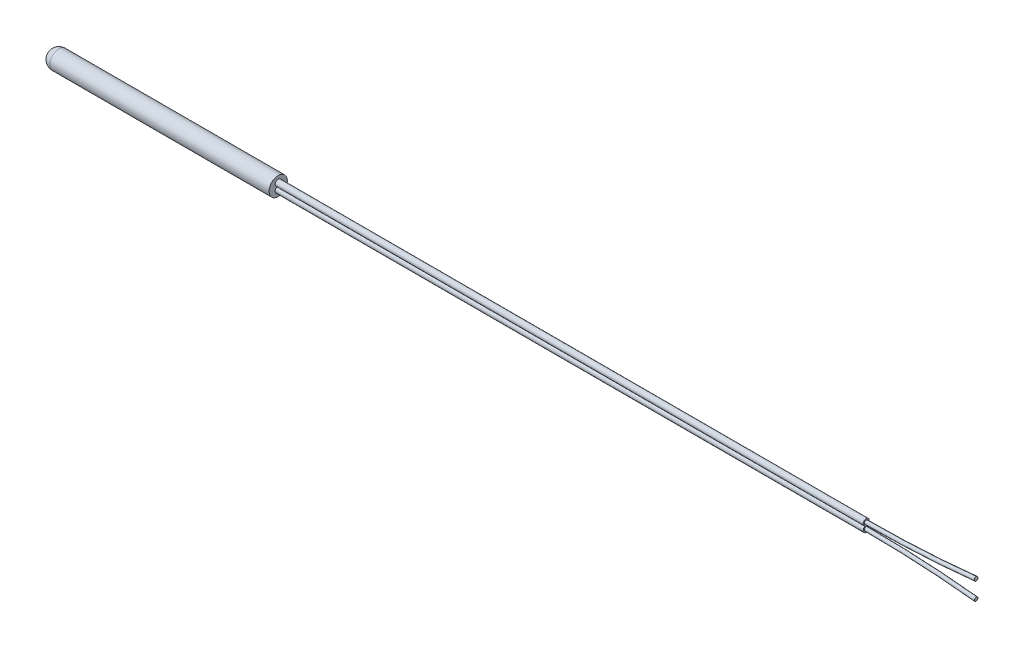
ISO-10303-21;
HEADER;
FILE_DESCRIPTION(('STEP AP214'),'2;1');
FILE_NAME('part.step','',(''),(''),'','','');
FILE_SCHEMA(('AUTOMOTIVE_DESIGN { 1 0 10303 214 1 1 1 1 }'));
ENDSEC;
DATA;
#1=APPLICATION_CONTEXT('core data for automotive mechanical design processes');
#2=APPLICATION_PROTOCOL_DEFINITION('international standard','automotive_design',2000,#1);
#3=PRODUCT_CONTEXT('',#1,'mechanical');
#4=PRODUCT('Part','Part','',(#3));
#5=PRODUCT_RELATED_PRODUCT_CATEGORY('part','',(#4));
#6=PRODUCT_DEFINITION_FORMATION('','',#4);
#7=PRODUCT_DEFINITION_CONTEXT('part definition',#1,'design');
#8=PRODUCT_DEFINITION('design','',#6,#7);
#9=PRODUCT_DEFINITION_SHAPE('','',#8);
#10=(LENGTH_UNIT() NAMED_UNIT(*) SI_UNIT(.MILLI.,.METRE.));
#11=(NAMED_UNIT(*) PLANE_ANGLE_UNIT() SI_UNIT($,.RADIAN.));
#12=(NAMED_UNIT(*) SI_UNIT($,.STERADIAN.) SOLID_ANGLE_UNIT());
#13=UNCERTAINTY_MEASURE_WITH_UNIT(LENGTH_MEASURE(1.E-05),#10,'distance_accuracy_value','');
#14=(GEOMETRIC_REPRESENTATION_CONTEXT(3) GLOBAL_UNCERTAINTY_ASSIGNED_CONTEXT((#13)) GLOBAL_UNIT_ASSIGNED_CONTEXT((#10,
#11,#12)) REPRESENTATION_CONTEXT('',''));
#15=CARTESIAN_POINT('',(0.,0.,0.));
#16=DIRECTION('',(0.,0.,1.));
#17=DIRECTION('',(1.,0.,0.));
#18=AXIS2_PLACEMENT_3D('',#15,#16,#17);
#19=CARTESIAN_POINT('',(34.0395985035608,0.,0.));
#20=DIRECTION('',(-1.,0.,0.));
#21=DIRECTION('',(0.,0.,0.999999999999998));
#22=AXIS2_PLACEMENT_3D('',#19,#20,#21);
#23=PLANE('',#22);
#24=CARTESIAN_POINT('',(34.0395985035608,0.121799289195743,0.));
#25=DIRECTION('',(-1.,0.,0.));
#26=DIRECTION('',(0.,0.,-0.999999999999998));
#27=AXIS2_PLACEMENT_3D('',#24,#25,#26);
#28=CIRCLE('',#27,0.0777066823762968);
#29=CARTESIAN_POINT('',(34.0395985035608,0.0440926068194375,0.));
#30=VERTEX_POINT('',#29);
#31=EDGE_CURVE('E150',#30,#30,#28,.T.);
#32=ORIENTED_EDGE('',*,*,#31,.T.);
#33=EDGE_LOOP('',(#32));
#34=FACE_BOUND('',#33,.T.);
#35=CARTESIAN_POINT('',(34.0395985035608,-0.121799289195812,0.));
#36=DIRECTION('',(1.,0.,0.));
#37=DIRECTION('',(0.,0.,0.999999999999998));
#38=AXIS2_PLACEMENT_3D('',#35,#36,#37);
#39=CIRCLE('',#38,0.127);
#40=CARTESIAN_POINT('',(34.0395985035609,0.,0.0359712823151618));
#41=VERTEX_POINT('',#40);
#42=CARTESIAN_POINT('',(34.0395985035608,0.,-0.0359712823152711));
#43=VERTEX_POINT('',#42);
#44=EDGE_CURVE('E90',#41,#43,#39,.T.);
#45=ORIENTED_EDGE('',*,*,#44,.T.);
#46=CARTESIAN_POINT('',(34.0395985035608,0.121799289195743,0.));
#47=DIRECTION('',(1.,0.,0.));
#48=DIRECTION('',(0.,0.,-0.999999999999998));
#49=AXIS2_PLACEMENT_3D('',#46,#47,#48);
#50=CIRCLE('',#49,0.127);
#51=EDGE_CURVE('E100',#43,#41,#50,.T.);
#52=ORIENTED_EDGE('',*,*,#51,.T.);
#53=EDGE_LOOP('',(#45,#52));
#54=FACE_BOUND('',#53,.T.);
#55=CARTESIAN_POINT('',(34.0395985035608,-0.121799289195812,0.));
#56=DIRECTION('',(-1.,0.,0.));
#57=DIRECTION('',(0.,0.,0.999999999999998));
#58=AXIS2_PLACEMENT_3D('',#55,#56,#57);
#59=CIRCLE('',#58,0.0777066823762968);
#60=CARTESIAN_POINT('',(34.0395985035608,-0.0440926068194028,0.));
#61=VERTEX_POINT('',#60);
#62=EDGE_CURVE('E11',#61,#61,#59,.F.);
#63=ORIENTED_EDGE('',*,*,#62,.F.);
#64=EDGE_LOOP('',(#63));
#65=FACE_BOUND('',#64,.T.);
#66=ADVANCED_FACE('F49',(#34,#54,#65),#23,.F.);
#67=CARTESIAN_POINT('',(9.52499999999999,0.380999999999999,0.));
#68=DIRECTION('',(-1.,0.,0.));
#69=DIRECTION('',(0.,0.,0.999999999999998));
#70=AXIS2_PLACEMENT_3D('',#67,#68,#69);
#71=PLANE('',#70);
#72=CARTESIAN_POINT('',(9.52499999999999,0.,0.));
#73=DIRECTION('',(-1.,0.,0.));
#74=DIRECTION('',(0.,0.,0.999999999999998));
#75=AXIS2_PLACEMENT_3D('',#72,#73,#74);
#76=CIRCLE('',#75,0.381);
#77=CARTESIAN_POINT('',(9.52499999999999,0.,0.380999999999998));
#78=VERTEX_POINT('',#77);
#79=EDGE_CURVE('E58',#78,#78,#76,.T.);
#80=ORIENTED_EDGE('',*,*,#79,.F.);
#81=EDGE_LOOP('',(#80));
#82=FACE_BOUND('',#81,.T.);
#83=CARTESIAN_POINT('',(9.525,-0.121799289195784,0.));
#84=DIRECTION('',(1.,0.,0.));
#85=DIRECTION('',(0.,0.,0.999999999999998));
#86=AXIS2_PLACEMENT_3D('',#83,#84,#85);
#87=CIRCLE('',#86,0.127);
#88=CARTESIAN_POINT('',(9.52499999999999,0.,0.0359712823152485));
#89=VERTEX_POINT('',#88);
#90=CARTESIAN_POINT('',(9.52499999999998,0.,-0.035971282315252));
#91=VERTEX_POINT('',#90);
#92=EDGE_CURVE('E77',#89,#91,#87,.T.);
#93=ORIENTED_EDGE('',*,*,#92,.F.);
#94=CARTESIAN_POINT('',(9.52499999999999,0.12179928919577,0.));
#95=DIRECTION('',(1.,0.,0.));
#96=DIRECTION('',(0.,0.,-0.999999999999998));
#97=AXIS2_PLACEMENT_3D('',#94,#95,#96);
#98=CIRCLE('',#97,0.127);
#99=EDGE_CURVE('E64',#91,#89,#98,.T.);
#100=ORIENTED_EDGE('',*,*,#99,.F.);
#101=EDGE_LOOP('',(#93,#100));
#102=FACE_BOUND('',#101,.T.);
#103=ADVANCED_FACE('F78',(#82,#102),#71,.F.);
#104=CARTESIAN_POINT('',(0.38100000000002,0.,0.));
#105=DIRECTION('',(-1.,0.,0.));
#106=DIRECTION('',(0.,0.999999999999999,0.));
#107=AXIS2_PLACEMENT_3D('',#104,#105,#106);
#108=SPHERICAL_SURFACE('',#107,0.380999999999999);
#109=CARTESIAN_POINT('',(0.38100000000002,0.,0.));
#110=DIRECTION('',(-1.,0.,0.));
#111=DIRECTION('',(0.,0.,0.999999999999998));
#112=AXIS2_PLACEMENT_3D('',#109,#110,#111);
#113=CIRCLE('',#112,0.380999999999999);
#114=CARTESIAN_POINT('',(0.38100000000002,0.,0.380999999999999));
#115=VERTEX_POINT('',#114);
#116=EDGE_CURVE('E103',#115,#115,#113,.T.);
#117=ORIENTED_EDGE('',*,*,#116,.T.);
#118=EDGE_LOOP('',(#117));
#119=FACE_BOUND('',#118,.T.);
#120=ADVANCED_FACE('F51',(#119),#108,.T.);
#121=CARTESIAN_POINT('',(0.,0.,0.));
#122=DIRECTION('',(-1.,0.,0.));
#123=DIRECTION('',(0.,0.,0.999999999999998));
#124=AXIS2_PLACEMENT_3D('',#121,#122,#123);
#125=CYLINDRICAL_SURFACE('',#124,0.380999999999999);
#126=CARTESIAN_POINT('',(0.38100000000002,0.,0.380999999999999));
#127=CARTESIAN_POINT('',(0.47625000000002,0.,0.380999999999999));
#128=CARTESIAN_POINT('',(0.57150000000002,0.,0.380999999999999));
#129=CARTESIAN_POINT('',(0.762000000000019,0.,0.380999999999999));
#130=CARTESIAN_POINT('',(0.857250000000019,0.,0.380999999999999));
#131=CARTESIAN_POINT('',(1.04775000000002,0.,0.380999999999999));
#132=CARTESIAN_POINT('',(1.14300000000002,0.,0.380999999999998));
#133=CARTESIAN_POINT('',(1.33350000000002,0.,0.380999999999998));
#134=CARTESIAN_POINT('',(1.42875000000002,0.,0.380999999999998));
#135=CARTESIAN_POINT('',(1.61925000000002,0.,0.380999999999998));
#136=CARTESIAN_POINT('',(1.71450000000002,0.,0.380999999999998));
#137=CARTESIAN_POINT('',(1.90500000000002,0.,0.380999999999998));
#138=CARTESIAN_POINT('',(2.00025000000001,0.,0.380999999999998));
#139=CARTESIAN_POINT('',(2.19075000000001,0.,0.380999999999998));
#140=CARTESIAN_POINT('',(2.28600000000001,0.,0.380999999999998));
#141=CARTESIAN_POINT('',(2.47650000000001,0.,0.380999999999998));
#142=CARTESIAN_POINT('',(2.57175000000001,0.,0.380999999999998));
#143=CARTESIAN_POINT('',(2.76225000000001,0.,0.380999999999998));
#144=CARTESIAN_POINT('',(2.85750000000001,0.,0.380999999999998));
#145=CARTESIAN_POINT('',(3.04800000000001,0.,0.380999999999998));
#146=CARTESIAN_POINT('',(3.14325000000001,0.,0.380999999999998));
#147=CARTESIAN_POINT('',(3.33375000000001,0.,0.380999999999998));
#148=CARTESIAN_POINT('',(3.42900000000001,0.,0.380999999999998));
#149=CARTESIAN_POINT('',(3.61950000000001,0.,0.380999999999998));
#150=CARTESIAN_POINT('',(3.71475000000001,0.,0.380999999999998));
#151=CARTESIAN_POINT('',(3.90525000000001,0.,0.380999999999998));
#152=CARTESIAN_POINT('',(4.00050000000001,0.,0.380999999999998));
#153=CARTESIAN_POINT('',(4.19100000000001,0.,0.380999999999998));
#154=CARTESIAN_POINT('',(4.28625000000001,0.,0.380999999999998));
#155=CARTESIAN_POINT('',(4.47675000000001,0.,0.380999999999998));
#156=CARTESIAN_POINT('',(4.57200000000001,0.,0.380999999999998));
#157=CARTESIAN_POINT('',(4.76250000000001,0.,0.380999999999998));
#158=CARTESIAN_POINT('',(4.85775000000001,0.,0.380999999999998));
#159=CARTESIAN_POINT('',(5.04825,0.,0.380999999999998));
#160=CARTESIAN_POINT('',(5.1435,0.,0.380999999999998));
#161=CARTESIAN_POINT('',(5.334,0.,0.380999999999998));
#162=CARTESIAN_POINT('',(5.42925,0.,0.380999999999998));
#163=CARTESIAN_POINT('',(5.61975,0.,0.380999999999998));
#164=CARTESIAN_POINT('',(5.715,0.,0.380999999999998));
#165=CARTESIAN_POINT('',(5.9055,0.,0.380999999999998));
#166=CARTESIAN_POINT('',(6.00075,0.,0.380999999999998));
#167=CARTESIAN_POINT('',(6.19125,0.,0.380999999999998));
#168=CARTESIAN_POINT('',(6.2865,0.,0.380999999999998));
#169=CARTESIAN_POINT('',(6.477,0.,0.380999999999998));
#170=CARTESIAN_POINT('',(6.57225,0.,0.380999999999998));
#171=CARTESIAN_POINT('',(6.76275,0.,0.380999999999998));
#172=CARTESIAN_POINT('',(6.858,0.,0.380999999999998));
#173=CARTESIAN_POINT('',(7.0485,0.,0.380999999999998));
#174=CARTESIAN_POINT('',(7.14375,0.,0.380999999999998));
#175=CARTESIAN_POINT('',(7.33425,0.,0.380999999999998));
#176=CARTESIAN_POINT('',(7.4295,0.,0.380999999999998));
#177=CARTESIAN_POINT('',(7.62,0.,0.380999999999998));
#178=CARTESIAN_POINT('',(7.71525,0.,0.380999999999998));
#179=CARTESIAN_POINT('',(7.90575,0.,0.380999999999998));
#180=CARTESIAN_POINT('',(8.00099999999999,0.,0.380999999999998));
#181=CARTESIAN_POINT('',(8.19149999999999,0.,0.380999999999998));
#182=CARTESIAN_POINT('',(8.28674999999999,0.,0.380999999999998));
#183=CARTESIAN_POINT('',(8.47724999999999,0.,0.380999999999998));
#184=CARTESIAN_POINT('',(8.57249999999999,0.,0.380999999999998));
#185=CARTESIAN_POINT('',(8.76299999999999,0.,0.380999999999998));
#186=CARTESIAN_POINT('',(8.85824999999999,0.,0.380999999999998));
#187=CARTESIAN_POINT('',(9.04874999999999,0.,0.380999999999998));
#188=CARTESIAN_POINT('',(9.14399999999999,0.,0.380999999999998));
#189=CARTESIAN_POINT('',(9.33449999999999,0.,0.380999999999998));
#190=CARTESIAN_POINT('',(9.42974999999999,0.,0.380999999999998));
#191=CARTESIAN_POINT('',(9.52499999999999,0.,0.380999999999998));
#192=B_SPLINE_CURVE_WITH_KNOTS('',3,(#126,#127,#128,#129,#130,#131,#132,#133,#134,#135,#136,
#137,#138,#139,#140,#141,#142,#143,#144,#145,#146,#147,#148,#149,#150,#151,#152,#153,#154,#155,
#156,#157,#158,#159,#160,#161,#162,#163,#164,#165,#166,#167,#168,#169,#170,#171,#172,#173,#174,
#175,#176,#177,#178,#179,#180,#181,#182,#183,#184,#185,#186,#187,#188,#189,#190,#191),
.UNSPECIFIED.,.F.,.F.,(4,2,2,2,2,2,2,2,2,2,2,2,2,2,2,2,2,2,2,2,2,2,2,2,2,2,2,2,2,2,2,2,4),(0.,
0.285749999999999,0.571499999999998,0.857249999999997,1.143,1.42875,1.71449999999999,
2.00024999999999,2.28599999999999,2.57174999999999,2.85749999999999,3.14324999999999,
3.42899999999999,3.71474999999999,4.00049999999999,4.28624999999999,4.57199999999998,
4.85774999999998,5.14349999999998,5.42924999999998,5.71499999999998,6.00074999999998,
6.28649999999998,6.57224999999998,6.85799999999998,7.14374999999998,7.42949999999998,
7.71524999999997,8.00099999999997,8.28674999999997,8.57249999999997,8.85824999999997,
9.14399999999997),.UNSPECIFIED.);
#193=EDGE_CURVE('BSEAM111',#115,#78,#192,.T.);
#194=ORIENTED_EDGE('',*,*,#116,.F.);
#195=ORIENTED_EDGE('',*,*,#79,.T.);
#196=ORIENTED_EDGE('',*,*,#193,.T.);
#197=ORIENTED_EDGE('',*,*,#193,.F.);
#198=EDGE_LOOP('',(#194,#196,#195,#197));
#199=FACE_BOUND('',#198,.T.);
#200=ADVANCED_FACE('F111',(#199),#125,.T.);
#201=CARTESIAN_POINT('',(9.6674128364997,-0.121799289195756,0.));
#202=DIRECTION('',(-1.,0.,0.));
#203=DIRECTION('',(0.,0.,0.999999999999998));
#204=AXIS2_PLACEMENT_3D('',#201,#202,#203);
#205=CYLINDRICAL_SURFACE('',#204,0.127);
#206=ORIENTED_EDGE('',*,*,#92,.T.);
#207=DIRECTION('',(-1.,0.,0.));
#208=VECTOR('',#207,1.);
#209=CARTESIAN_POINT('',(9.6674128364997,0.,-0.0359712823152589));
#210=LINE('',#209,#208);
#211=EDGE_CURVE('E71',#43,#91,#210,.T.);
#212=ORIENTED_EDGE('',*,*,#211,.F.);
#213=ORIENTED_EDGE('',*,*,#44,.F.);
#214=DIRECTION('',(-1.,0.,0.));
#215=VECTOR('',#214,1.);
#216=CARTESIAN_POINT('',(9.66741283649969,0.,0.0359712823151687));
#217=LINE('',#216,#215);
#218=EDGE_CURVE('E85',#41,#89,#217,.T.);
#219=ORIENTED_EDGE('',*,*,#218,.T.);
#220=EDGE_LOOP('',(#206,#212,#213,#219));
#221=FACE_BOUND('',#220,.T.);
#222=ADVANCED_FACE('F88',(#221),#205,.T.);
#223=CARTESIAN_POINT('',(9.6674128364997,0.121799289195784,0.));
#224=DIRECTION('',(-1.,0.,0.));
#225=DIRECTION('',(0.,0.,0.999999999999998));
#226=AXIS2_PLACEMENT_3D('',#223,#224,#225);
#227=CYLINDRICAL_SURFACE('',#226,0.127);
#228=ORIENTED_EDGE('',*,*,#99,.T.);
#229=ORIENTED_EDGE('',*,*,#218,.F.);
#230=ORIENTED_EDGE('',*,*,#51,.F.);
#231=ORIENTED_EDGE('',*,*,#211,.T.);
#232=EDGE_LOOP('',(#228,#229,#230,#231));
#233=FACE_BOUND('',#232,.T.);
#234=ADVANCED_FACE('F84',(#233),#227,.T.);
#235=CARTESIAN_POINT('',(34.0395985035608,-42.86089342759,0.));
#236=DIRECTION('',(0.,0.,0.999999999999998));
#237=DIRECTION('',(1.,0.,0.));
#238=AXIS2_PLACEMENT_3D('',#235,#236,#237);
#239=TOROIDAL_SURFACE('',#238,42.7390941383943,0.0777066823762968);
#240=CARTESIAN_POINT('',(38.6222346939246,-0.368192721265273,0.));
#241=DIRECTION('',(0.994234940233603,-0.107223521760303,0.));
#242=DIRECTION('',(0.,0.,-0.999999999999998));
#243=AXIS2_PLACEMENT_3D('',#240,#241,#242);
#244=CIRCLE('',#243,0.0777066823762968);
#245=CARTESIAN_POINT('',(38.6305666780733,-0.290934022557018,0.));
#246=VERTEX_POINT('',#245);
#247=EDGE_CURVE('E81',#246,#246,#244,.T.);
#248=CARTESIAN_POINT('',(34.0395985035608,-42.86089342759,0.));
#249=DIRECTION('',(0.,0.,0.999999999999998));
#250=DIRECTION('',(1.,0.,0.));
#251=AXIS2_PLACEMENT_3D('',#248,#249,#250);
#252=CIRCLE('',#251,42.8168008207706);
#253=EDGE_CURVE('',#246,#61,#252,.T.);
#254=ORIENTED_EDGE('',*,*,#247,.F.);
#255=ORIENTED_EDGE('',*,*,#62,.T.);
#256=ORIENTED_EDGE('',*,*,#253,.T.);
#257=ORIENTED_EDGE('',*,*,#253,.F.);
#258=EDGE_LOOP('',(#254,#256,#255,#257));
#259=FACE_BOUND('',#258,.T.);
#260=ADVANCED_FACE('F128',(#259),#239,.T.);
#261=CARTESIAN_POINT('',(38.6222346939246,-0.368192721265273,0.));
#262=DIRECTION('',(0.994234940233603,-0.107223521760303,0.));
#263=DIRECTION('',(0.,0.,-0.999999999999998));
#264=AXIS2_PLACEMENT_3D('',#261,#262,#263);
#265=PLANE('',#264);
#266=ORIENTED_EDGE('',*,*,#247,.T.);
#267=EDGE_LOOP('',(#266));
#268=FACE_BOUND('',#267,.T.);
#269=ADVANCED_FACE('F132',(#268),#265,.T.);
#270=CARTESIAN_POINT('',(34.0395985035608,42.8608934275901,0.));
#271=DIRECTION('',(0.,0.,-0.999999999999998));
#272=DIRECTION('',(-1.,0.,0.));
#273=AXIS2_PLACEMENT_3D('',#270,#271,#272);
#274=TOROIDAL_SURFACE('',#273,42.7390941383943,0.0777066823762968);
#275=CARTESIAN_POINT('',(38.6222346939246,0.368192721265245,0.));
#276=DIRECTION('',(-0.994234940233604,-0.107223521760302,0.));
#277=DIRECTION('',(0.,0.,-0.999999999999998));
#278=AXIS2_PLACEMENT_3D('',#275,#276,#277);
#279=CIRCLE('',#278,0.0777066823762968);
#280=CARTESIAN_POINT('',(38.6305666780733,0.290934022557053,0.));
#281=VERTEX_POINT('',#280);
#282=EDGE_CURVE('E148',#281,#281,#279,.T.);
#283=CARTESIAN_POINT('',(34.0395985035608,42.8608934275901,0.));
#284=DIRECTION('',(0.,0.,-0.999999999999998));
#285=DIRECTION('',(-1.,0.,0.));
#286=AXIS2_PLACEMENT_3D('',#283,#284,#285);
#287=CIRCLE('',#286,42.8168008207706);
#288=EDGE_CURVE('',#281,#30,#287,.T.);
#289=ORIENTED_EDGE('',*,*,#282,.T.);
#290=ORIENTED_EDGE('',*,*,#31,.F.);
#291=ORIENTED_EDGE('',*,*,#288,.T.);
#292=ORIENTED_EDGE('',*,*,#288,.F.);
#293=EDGE_LOOP('',(#289,#291,#290,#292));
#294=FACE_BOUND('',#293,.T.);
#295=ADVANCED_FACE('F136',(#294),#274,.T.);
#296=CARTESIAN_POINT('',(38.6222346939246,0.368192721265245,0.));
#297=DIRECTION('',(0.994234940233604,0.107223521760302,0.));
#298=DIRECTION('',(0.,0.,-0.999999999999998));
#299=AXIS2_PLACEMENT_3D('',#296,#297,#298);
#300=PLANE('',#299);
#301=ORIENTED_EDGE('',*,*,#282,.F.);
#302=EDGE_LOOP('',(#301));
#303=FACE_BOUND('',#302,.T.);
#304=ADVANCED_FACE('F140',(#303),#300,.T.);
#305=CLOSED_SHELL('',(#66,#103,#120,#200,#222,#234,#260,#269,#295,#304));
#306=MANIFOLD_SOLID_BREP('B2',#305);
#307=ADVANCED_BREP_SHAPE_REPRESENTATION('',(#18,#306),#14);
#308=SHAPE_DEFINITION_REPRESENTATION(#9,#307);
ENDSEC;
END-ISO-10303-21;
